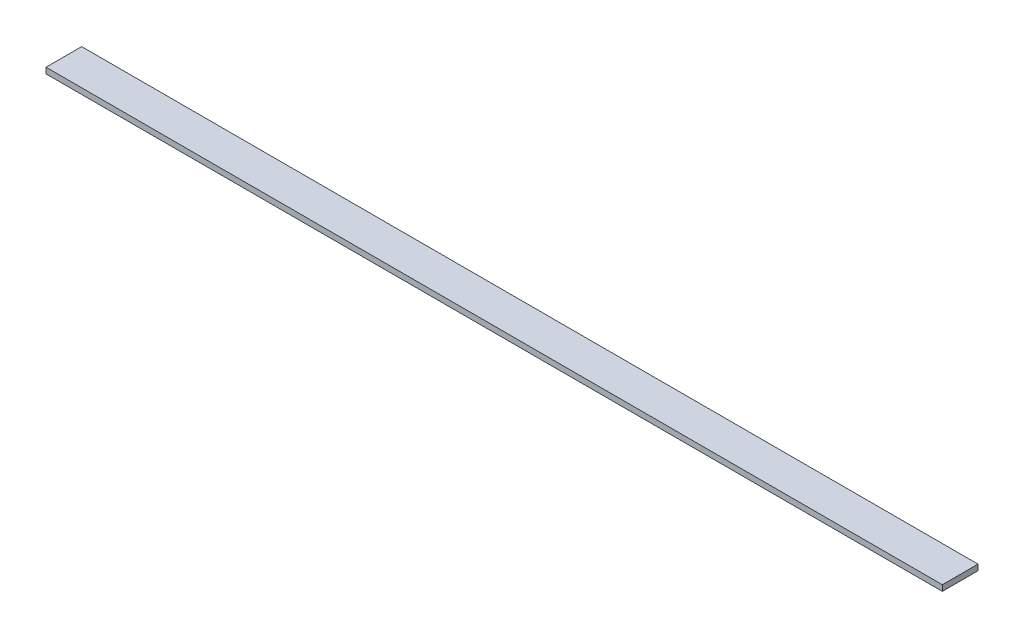
ISO-10303-21;
HEADER;
FILE_DESCRIPTION(('STEP AP214'),'2;1');
FILE_NAME('part.step','',(''),(''),'','','');
FILE_SCHEMA(('AUTOMOTIVE_DESIGN { 1 0 10303 214 1 1 1 1 }'));
ENDSEC;
DATA;
#1=APPLICATION_CONTEXT('core data for automotive mechanical design processes');
#2=APPLICATION_PROTOCOL_DEFINITION('international standard','automotive_design',2000,#1);
#3=PRODUCT_CONTEXT('',#1,'mechanical');
#4=PRODUCT('Part','Part','',(#3));
#5=PRODUCT_RELATED_PRODUCT_CATEGORY('part','',(#4));
#6=PRODUCT_DEFINITION_FORMATION('','',#4);
#7=PRODUCT_DEFINITION_CONTEXT('part definition',#1,'design');
#8=PRODUCT_DEFINITION('design','',#6,#7);
#9=PRODUCT_DEFINITION_SHAPE('','',#8);
#10=(LENGTH_UNIT() NAMED_UNIT(*) SI_UNIT(.MILLI.,.METRE.));
#11=(NAMED_UNIT(*) PLANE_ANGLE_UNIT() SI_UNIT($,.RADIAN.));
#12=(NAMED_UNIT(*) SI_UNIT($,.STERADIAN.) SOLID_ANGLE_UNIT());
#13=UNCERTAINTY_MEASURE_WITH_UNIT(LENGTH_MEASURE(1.E-05),#10,'distance_accuracy_value','');
#14=(GEOMETRIC_REPRESENTATION_CONTEXT(3) GLOBAL_UNCERTAINTY_ASSIGNED_CONTEXT((#13)) GLOBAL_UNIT_ASSIGNED_CONTEXT((#10,
#11,#12)) REPRESENTATION_CONTEXT('',''));
#15=CARTESIAN_POINT('',(0.,0.,0.));
#16=DIRECTION('',(0.,0.,1.));
#17=DIRECTION('',(1.,0.,0.));
#18=AXIS2_PLACEMENT_3D('',#15,#16,#17);
#19=CARTESIAN_POINT('',(-3811.4111111111,38.1,-1664.22916666666));
#20=DIRECTION('',(1.,0.,0.));
#21=DIRECTION('',(0.,0.,-1.));
#22=AXIS2_PLACEMENT_3D('',#19,#20,#21);
#23=PLANE('',#22);
#24=DIRECTION('',(0.,0.,1.));
#25=VECTOR('',#24,1.);
#26=CARTESIAN_POINT('',(-3811.4111111111,0.,-1664.22916666666));
#27=LINE('',#26,#25);
#28=CARTESIAN_POINT('',(-3811.4111111111,0.,-1664.22916666666));
#29=VERTEX_POINT('',#28);
#30=CARTESIAN_POINT('',(-3811.4111111111,0.,-1429.27916666666));
#31=VERTEX_POINT('',#30);
#32=EDGE_CURVE('E96',#29,#31,#27,.T.);
#33=ORIENTED_EDGE('',*,*,#32,.T.);
#34=DIRECTION('',(0.,-1.,0.));
#35=VECTOR('',#34,1.);
#36=CARTESIAN_POINT('',(-3811.4111111111,38.1,-1429.27916666666));
#37=LINE('',#36,#35);
#38=CARTESIAN_POINT('',(-3811.4111111111,38.1,-1429.27916666666));
#39=VERTEX_POINT('',#38);
#40=EDGE_CURVE('E11',#39,#31,#37,.T.);
#41=ORIENTED_EDGE('',*,*,#40,.F.);
#42=DIRECTION('',(0.,0.,1.));
#43=VECTOR('',#42,1.);
#44=CARTESIAN_POINT('',(-3811.4111111111,38.1,-1664.22916666666));
#45=LINE('',#44,#43);
#46=CARTESIAN_POINT('',(-3811.4111111111,38.1,-1664.22916666666));
#47=VERTEX_POINT('',#46);
#48=EDGE_CURVE('E84',#47,#39,#45,.T.);
#49=ORIENTED_EDGE('',*,*,#48,.F.);
#50=DIRECTION('',(0.,-1.,0.));
#51=VECTOR('',#50,1.);
#52=CARTESIAN_POINT('',(-3811.4111111111,38.1,-1664.22916666666));
#53=LINE('',#52,#51);
#54=EDGE_CURVE('E92',#47,#29,#53,.T.);
#55=ORIENTED_EDGE('',*,*,#54,.T.);
#56=EDGE_LOOP('',(#33,#41,#49,#55));
#57=FACE_BOUND('',#56,.T.);
#58=ADVANCED_FACE('F33',(#57),#23,.F.);
#59=CARTESIAN_POINT('',(-3811.4111111111,38.1,-1429.27916666666));
#60=DIRECTION('',(0.,0.,-1.));
#61=DIRECTION('',(-1.,0.,0.));
#62=AXIS2_PLACEMENT_3D('',#59,#60,#61);
#63=PLANE('',#62);
#64=DIRECTION('',(1.,0.,0.));
#65=VECTOR('',#64,1.);
#66=CARTESIAN_POINT('',(-3811.4111111111,0.,-1429.27916666666));
#67=LINE('',#66,#65);
#68=CARTESIAN_POINT('',(2094.0888888889,0.,-1429.27916666666));
#69=VERTEX_POINT('',#68);
#70=EDGE_CURVE('E88',#31,#69,#67,.T.);
#71=ORIENTED_EDGE('',*,*,#70,.T.);
#72=DIRECTION('',(0.,-1.,0.));
#73=VECTOR('',#72,1.);
#74=CARTESIAN_POINT('',(2094.0888888889,38.1,-1429.27916666666));
#75=LINE('',#74,#73);
#76=CARTESIAN_POINT('',(2094.0888888889,38.1,-1429.27916666666));
#77=VERTEX_POINT('',#76);
#78=EDGE_CURVE('E41',#77,#69,#75,.T.);
#79=ORIENTED_EDGE('',*,*,#78,.F.);
#80=DIRECTION('',(1.,0.,0.));
#81=VECTOR('',#80,1.);
#82=CARTESIAN_POINT('',(-3811.4111111111,38.1,-1429.27916666666));
#83=LINE('',#82,#81);
#84=EDGE_CURVE('E79',#39,#77,#83,.T.);
#85=ORIENTED_EDGE('',*,*,#84,.F.);
#86=ORIENTED_EDGE('',*,*,#40,.T.);
#87=EDGE_LOOP('',(#71,#79,#85,#86));
#88=FACE_BOUND('',#87,.T.);
#89=ADVANCED_FACE('F87',(#88),#63,.F.);
#90=CARTESIAN_POINT('',(2094.0888888889,38.1,-1664.22916666666));
#91=DIRECTION('',(-1.,0.,0.));
#92=DIRECTION('',(0.,0.,1.));
#93=AXIS2_PLACEMENT_3D('',#90,#91,#92);
#94=PLANE('',#93);
#95=DIRECTION('',(0.,0.,-1.));
#96=VECTOR('',#95,1.);
#97=CARTESIAN_POINT('',(2094.0888888889,0.,-1664.22916666666));
#98=LINE('',#97,#96);
#99=CARTESIAN_POINT('',(2094.0888888889,0.,-1664.22916666666));
#100=VERTEX_POINT('',#99);
#101=EDGE_CURVE('E66',#69,#100,#98,.T.);
#102=ORIENTED_EDGE('',*,*,#101,.T.);
#103=DIRECTION('',(0.,-1.,0.));
#104=VECTOR('',#103,1.);
#105=CARTESIAN_POINT('',(2094.0888888889,38.1,-1664.22916666666));
#106=LINE('',#105,#104);
#107=CARTESIAN_POINT('',(2094.0888888889,38.1,-1664.22916666666));
#108=VERTEX_POINT('',#107);
#109=EDGE_CURVE('E89',#108,#100,#106,.T.);
#110=ORIENTED_EDGE('',*,*,#109,.F.);
#111=DIRECTION('',(0.,0.,-1.));
#112=VECTOR('',#111,1.);
#113=CARTESIAN_POINT('',(2094.0888888889,38.1,-1664.22916666666));
#114=LINE('',#113,#112);
#115=EDGE_CURVE('E82',#77,#108,#114,.T.);
#116=ORIENTED_EDGE('',*,*,#115,.F.);
#117=ORIENTED_EDGE('',*,*,#78,.T.);
#118=EDGE_LOOP('',(#102,#110,#116,#117));
#119=FACE_BOUND('',#118,.T.);
#120=ADVANCED_FACE('F90',(#119),#94,.F.);
#121=CARTESIAN_POINT('',(-3811.4111111111,38.1,-1664.22916666666));
#122=DIRECTION('',(0.,0.,1.));
#123=DIRECTION('',(1.,0.,0.));
#124=AXIS2_PLACEMENT_3D('',#121,#122,#123);
#125=PLANE('',#124);
#126=DIRECTION('',(-1.,0.,0.));
#127=VECTOR('',#126,1.);
#128=CARTESIAN_POINT('',(-3811.4111111111,0.,-1664.22916666666));
#129=LINE('',#128,#127);
#130=EDGE_CURVE('E72',#100,#29,#129,.T.);
#131=ORIENTED_EDGE('',*,*,#130,.T.);
#132=ORIENTED_EDGE('',*,*,#54,.F.);
#133=DIRECTION('',(-1.,0.,0.));
#134=VECTOR('',#133,1.);
#135=CARTESIAN_POINT('',(-3811.4111111111,38.1,-1664.22916666666));
#136=LINE('',#135,#134);
#137=EDGE_CURVE('E49',#108,#47,#136,.T.);
#138=ORIENTED_EDGE('',*,*,#137,.F.);
#139=ORIENTED_EDGE('',*,*,#109,.T.);
#140=EDGE_LOOP('',(#131,#132,#138,#139));
#141=FACE_BOUND('',#140,.T.);
#142=ADVANCED_FACE('F103',(#141),#125,.F.);
#143=CARTESIAN_POINT('',(0.,38.1,0.));
#144=DIRECTION('',(0.,1.,0.));
#145=DIRECTION('',(0.,0.,1.));
#146=AXIS2_PLACEMENT_3D('',#143,#144,#145);
#147=PLANE('',#146);
#148=ORIENTED_EDGE('',*,*,#48,.T.);
#149=ORIENTED_EDGE('',*,*,#84,.T.);
#150=ORIENTED_EDGE('',*,*,#115,.T.);
#151=ORIENTED_EDGE('',*,*,#137,.T.);
#152=EDGE_LOOP('',(#148,#149,#150,#151));
#153=FACE_BOUND('',#152,.T.);
#154=ADVANCED_FACE('F80',(#153),#147,.T.);
#155=CARTESIAN_POINT('',(0.,0.,0.));
#156=DIRECTION('',(0.,1.,0.));
#157=DIRECTION('',(0.,0.,1.));
#158=AXIS2_PLACEMENT_3D('',#155,#156,#157);
#159=PLANE('',#158);
#160=ORIENTED_EDGE('',*,*,#32,.F.);
#161=ORIENTED_EDGE('',*,*,#130,.F.);
#162=ORIENTED_EDGE('',*,*,#101,.F.);
#163=ORIENTED_EDGE('',*,*,#70,.F.);
#164=EDGE_LOOP('',(#160,#161,#162,#163));
#165=FACE_BOUND('',#164,.T.);
#166=ADVANCED_FACE('F106',(#165),#159,.F.);
#167=CLOSED_SHELL('',(#58,#89,#120,#142,#154,#166));
#168=MANIFOLD_SOLID_BREP('B2',#167);
#169=ADVANCED_BREP_SHAPE_REPRESENTATION('',(#18,#168),#14);
#170=SHAPE_DEFINITION_REPRESENTATION(#9,#169);
ENDSEC;
END-ISO-10303-21;
